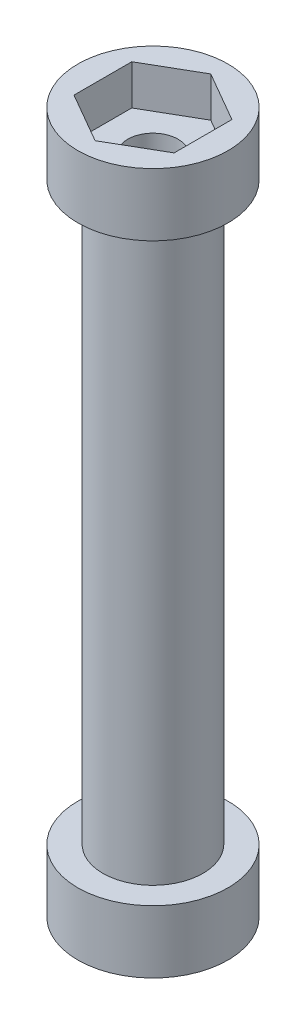
ISO-10303-21;
HEADER;
FILE_DESCRIPTION(('STEP AP214'),'2;1');
FILE_NAME('part.step','',(''),(''),'','','');
FILE_SCHEMA(('AUTOMOTIVE_DESIGN { 1 0 10303 214 1 1 1 1 }'));
ENDSEC;
DATA;
#1=APPLICATION_CONTEXT('core data for automotive mechanical design processes');
#2=APPLICATION_PROTOCOL_DEFINITION('international standard','automotive_design',2000,#1);
#3=PRODUCT_CONTEXT('',#1,'mechanical');
#4=PRODUCT('Part','Part','',(#3));
#5=PRODUCT_RELATED_PRODUCT_CATEGORY('part','',(#4));
#6=PRODUCT_DEFINITION_FORMATION('','',#4);
#7=PRODUCT_DEFINITION_CONTEXT('part definition',#1,'design');
#8=PRODUCT_DEFINITION('design','',#6,#7);
#9=PRODUCT_DEFINITION_SHAPE('','',#8);
#10=(LENGTH_UNIT() NAMED_UNIT(*) SI_UNIT(.MILLI.,.METRE.));
#11=(NAMED_UNIT(*) PLANE_ANGLE_UNIT() SI_UNIT($,.RADIAN.));
#12=(NAMED_UNIT(*) SI_UNIT($,.STERADIAN.) SOLID_ANGLE_UNIT());
#13=UNCERTAINTY_MEASURE_WITH_UNIT(LENGTH_MEASURE(1.E-05),#10,'distance_accuracy_value','');
#14=(GEOMETRIC_REPRESENTATION_CONTEXT(3) GLOBAL_UNCERTAINTY_ASSIGNED_CONTEXT((#13)) GLOBAL_UNIT_ASSIGNED_CONTEXT((#10,
#11,#12)) REPRESENTATION_CONTEXT('',''));
#15=CARTESIAN_POINT('',(0.,0.,0.));
#16=DIRECTION('',(0.,0.,1.));
#17=DIRECTION('',(1.,0.,0.));
#18=AXIS2_PLACEMENT_3D('',#15,#16,#17);
#19=CARTESIAN_POINT('',(0.,28.,0.));
#20=DIRECTION('',(0.,1.,0.));
#21=DIRECTION('',(0.,0.,1.));
#22=AXIS2_PLACEMENT_3D('',#19,#20,#21);
#23=PLANE('',#22);
#24=CARTESIAN_POINT('',(0.,28.,0.));
#25=DIRECTION('',(0.,1.,0.));
#26=DIRECTION('',(0.,0.,1.));
#27=AXIS2_PLACEMENT_3D('',#24,#25,#26);
#28=CIRCLE('',#27,3.);
#29=CARTESIAN_POINT('',(0.,28.,3.));
#30=VERTEX_POINT('',#29);
#31=EDGE_CURVE('E183',#30,#30,#28,.T.);
#32=ORIENTED_EDGE('',*,*,#31,.T.);
#33=EDGE_LOOP('',(#32));
#34=FACE_BOUND('',#33,.T.);
#35=DIRECTION('',(0.,0.,-1.));
#36=VECTOR('',#35,1.);
#37=CARTESIAN_POINT('',(-2.,28.,0.));
#38=LINE('',#37,#36);
#39=CARTESIAN_POINT('',(-2.,28.,1.15470053837925));
#40=VERTEX_POINT('',#39);
#41=CARTESIAN_POINT('',(-2.,28.,-1.15470053837925));
#42=VERTEX_POINT('',#41);
#43=EDGE_CURVE('E152',#40,#42,#38,.T.);
#44=ORIENTED_EDGE('',*,*,#43,.T.);
#45=DIRECTION('',(0.866025403784439,0.,-0.5));
#46=VECTOR('',#45,1.);
#47=CARTESIAN_POINT('',(-1.,28.,-1.73205080756888));
#48=LINE('',#47,#46);
#49=CARTESIAN_POINT('',(0.,28.,-2.3094010767585));
#50=VERTEX_POINT('',#49);
#51=EDGE_CURVE('E63',#42,#50,#48,.T.);
#52=ORIENTED_EDGE('',*,*,#51,.T.);
#53=DIRECTION('',(0.866025403784439,0.,0.5));
#54=VECTOR('',#53,1.);
#55=CARTESIAN_POINT('',(1.,28.,-1.73205080756888));
#56=LINE('',#55,#54);
#57=CARTESIAN_POINT('',(2.,28.,-1.15470053837925));
#58=VERTEX_POINT('',#57);
#59=EDGE_CURVE('E139',#50,#58,#56,.T.);
#60=ORIENTED_EDGE('',*,*,#59,.T.);
#61=DIRECTION('',(0.,0.,1.));
#62=VECTOR('',#61,1.);
#63=CARTESIAN_POINT('',(2.,28.,0.));
#64=LINE('',#63,#62);
#65=CARTESIAN_POINT('',(2.,28.,1.15470053837925));
#66=VERTEX_POINT('',#65);
#67=EDGE_CURVE('E143',#58,#66,#64,.T.);
#68=ORIENTED_EDGE('',*,*,#67,.T.);
#69=DIRECTION('',(-0.866025403784439,0.,0.5));
#70=VECTOR('',#69,1.);
#71=CARTESIAN_POINT('',(1.,28.,1.73205080756888));
#72=LINE('',#71,#70);
#73=CARTESIAN_POINT('',(0.,28.,2.3094010767585));
#74=VERTEX_POINT('',#73);
#75=EDGE_CURVE('E147',#66,#74,#72,.T.);
#76=ORIENTED_EDGE('',*,*,#75,.T.);
#77=DIRECTION('',(-0.866025403784439,0.,-0.5));
#78=VECTOR('',#77,1.);
#79=CARTESIAN_POINT('',(-1.,28.,1.73205080756888));
#80=LINE('',#79,#78);
#81=EDGE_CURVE('E125',#74,#40,#80,.T.);
#82=ORIENTED_EDGE('',*,*,#81,.T.);
#83=EDGE_LOOP('',(#44,#52,#60,#68,#76,#82));
#84=FACE_BOUND('',#83,.T.);
#85=ADVANCED_FACE('F45',(#34,#84),#23,.T.);
#86=CARTESIAN_POINT('',(0.,28.,0.));
#87=DIRECTION('',(0.,-1.,0.));
#88=DIRECTION('',(0.,0.,-1.));
#89=AXIS2_PLACEMENT_3D('',#86,#87,#88);
#90=CYLINDRICAL_SURFACE('',#89,2.);
#91=CARTESIAN_POINT('',(0.,2.5,0.));
#92=DIRECTION('',(0.,1.,0.));
#93=DIRECTION('',(0.,0.,1.));
#94=AXIS2_PLACEMENT_3D('',#91,#92,#93);
#95=CIRCLE('',#94,2.);
#96=CARTESIAN_POINT('',(0.,2.5,2.));
#97=VERTEX_POINT('',#96);
#98=EDGE_CURVE('E182',#97,#97,#95,.T.);
#99=ORIENTED_EDGE('',*,*,#98,.T.);
#100=EDGE_LOOP('',(#99));
#101=FACE_BOUND('',#100,.T.);
#102=CARTESIAN_POINT('',(0.,25.5,0.));
#103=DIRECTION('',(0.,1.,0.));
#104=DIRECTION('',(0.,0.,1.));
#105=AXIS2_PLACEMENT_3D('',#102,#103,#104);
#106=CIRCLE('',#105,2.);
#107=CARTESIAN_POINT('',(0.,25.5,2.));
#108=VERTEX_POINT('',#107);
#109=EDGE_CURVE('E11',#108,#108,#106,.T.);
#110=ORIENTED_EDGE('',*,*,#109,.F.);
#111=EDGE_LOOP('',(#110));
#112=FACE_BOUND('',#111,.T.);
#113=ADVANCED_FACE('F47',(#101,#112),#90,.T.);
#114=CARTESIAN_POINT('',(0.,0.,0.));
#115=DIRECTION('',(0.,1.,0.));
#116=DIRECTION('',(0.,0.,1.));
#117=AXIS2_PLACEMENT_3D('',#114,#115,#116);
#118=PLANE('',#117);
#119=CARTESIAN_POINT('',(0.,0.,0.));
#120=DIRECTION('',(0.,1.,0.));
#121=DIRECTION('',(0.,0.,1.));
#122=AXIS2_PLACEMENT_3D('',#119,#120,#121);
#123=CIRCLE('',#122,1.6);
#124=CARTESIAN_POINT('',(0.,0.,1.6));
#125=VERTEX_POINT('',#124);
#126=EDGE_CURVE('E174',#125,#125,#123,.T.);
#127=ORIENTED_EDGE('',*,*,#126,.T.);
#128=EDGE_LOOP('',(#127));
#129=FACE_BOUND('',#128,.T.);
#130=CARTESIAN_POINT('',(0.,0.,0.));
#131=DIRECTION('',(0.,1.,0.));
#132=DIRECTION('',(0.,0.,1.));
#133=AXIS2_PLACEMENT_3D('',#130,#131,#132);
#134=CIRCLE('',#133,3.);
#135=CARTESIAN_POINT('',(0.,0.,3.));
#136=VERTEX_POINT('',#135);
#137=EDGE_CURVE('E190',#136,#136,#134,.T.);
#138=ORIENTED_EDGE('',*,*,#137,.F.);
#139=EDGE_LOOP('',(#138));
#140=FACE_BOUND('',#139,.T.);
#141=ADVANCED_FACE('F206',(#129,#140),#118,.F.);
#142=CARTESIAN_POINT('',(0.,28.,0.));
#143=DIRECTION('',(0.,-1.,0.));
#144=DIRECTION('',(0.,0.,-1.));
#145=AXIS2_PLACEMENT_3D('',#142,#143,#144);
#146=CYLINDRICAL_SURFACE('',#145,1.);
#147=CARTESIAN_POINT('',(0.,26.4,0.));
#148=DIRECTION('',(0.,-1.,0.));
#149=DIRECTION('',(0.,0.,-1.));
#150=AXIS2_PLACEMENT_3D('',#147,#148,#149);
#151=CIRCLE('',#150,1.);
#152=CARTESIAN_POINT('',(0.,26.4,-1.));
#153=VERTEX_POINT('',#152);
#154=EDGE_CURVE('E49',#153,#153,#151,.T.);
#155=ORIENTED_EDGE('',*,*,#154,.F.);
#156=EDGE_LOOP('',(#155));
#157=FACE_BOUND('',#156,.T.);
#158=CARTESIAN_POINT('',(0.,1.5,0.));
#159=DIRECTION('',(0.,1.,0.));
#160=DIRECTION('',(0.,0.,1.));
#161=AXIS2_PLACEMENT_3D('',#158,#159,#160);
#162=CIRCLE('',#161,1.);
#163=CARTESIAN_POINT('',(0.,1.5,1.));
#164=VERTEX_POINT('',#163);
#165=EDGE_CURVE('E173',#164,#164,#162,.T.);
#166=ORIENTED_EDGE('',*,*,#165,.F.);
#167=EDGE_LOOP('',(#166));
#168=FACE_BOUND('',#167,.T.);
#169=ADVANCED_FACE('F203',(#157,#168),#146,.F.);
#170=CARTESIAN_POINT('',(0.,2.5,0.));
#171=DIRECTION('',(0.,1.,0.));
#172=DIRECTION('',(0.,0.,1.));
#173=AXIS2_PLACEMENT_3D('',#170,#171,#172);
#174=PLANE('',#173);
#175=CARTESIAN_POINT('',(0.,2.5,0.));
#176=DIRECTION('',(0.,1.,0.));
#177=DIRECTION('',(0.,0.,1.));
#178=AXIS2_PLACEMENT_3D('',#175,#176,#177);
#179=CIRCLE('',#178,3.);
#180=CARTESIAN_POINT('',(0.,2.5,3.));
#181=VERTEX_POINT('',#180);
#182=EDGE_CURVE('E55',#181,#181,#179,.T.);
#183=ORIENTED_EDGE('',*,*,#182,.T.);
#184=EDGE_LOOP('',(#183));
#185=FACE_BOUND('',#184,.T.);
#186=ORIENTED_EDGE('',*,*,#98,.F.);
#187=EDGE_LOOP('',(#186));
#188=FACE_BOUND('',#187,.T.);
#189=ADVANCED_FACE('F205',(#185,#188),#174,.T.);
#190=CARTESIAN_POINT('',(0.,2.5,0.));
#191=DIRECTION('',(0.,-1.,0.));
#192=DIRECTION('',(0.,0.,-1.));
#193=AXIS2_PLACEMENT_3D('',#190,#191,#192);
#194=CYLINDRICAL_SURFACE('',#193,3.);
#195=ORIENTED_EDGE('',*,*,#182,.F.);
#196=EDGE_LOOP('',(#195));
#197=FACE_BOUND('',#196,.T.);
#198=ORIENTED_EDGE('',*,*,#137,.T.);
#199=EDGE_LOOP('',(#198));
#200=FACE_BOUND('',#199,.T.);
#201=ADVANCED_FACE('F213',(#197,#200),#194,.T.);
#202=CARTESIAN_POINT('',(0.,25.5,0.));
#203=DIRECTION('',(0.,1.,0.));
#204=DIRECTION('',(0.,0.,1.));
#205=AXIS2_PLACEMENT_3D('',#202,#203,#204);
#206=CYLINDRICAL_SURFACE('',#205,3.);
#207=CARTESIAN_POINT('',(0.,25.5,0.));
#208=DIRECTION('',(0.,1.,0.));
#209=DIRECTION('',(0.,0.,1.));
#210=AXIS2_PLACEMENT_3D('',#207,#208,#209);
#211=CIRCLE('',#210,3.);
#212=CARTESIAN_POINT('',(0.,25.5,3.));
#213=VERTEX_POINT('',#212);
#214=EDGE_CURVE('E178',#213,#213,#211,.T.);
#215=ORIENTED_EDGE('',*,*,#214,.T.);
#216=EDGE_LOOP('',(#215));
#217=FACE_BOUND('',#216,.T.);
#218=ORIENTED_EDGE('',*,*,#31,.F.);
#219=EDGE_LOOP('',(#218));
#220=FACE_BOUND('',#219,.T.);
#221=ADVANCED_FACE('F261',(#217,#220),#206,.T.);
#222=CARTESIAN_POINT('',(0.,25.5,0.));
#223=DIRECTION('',(0.,1.,0.));
#224=DIRECTION('',(0.,0.,1.));
#225=AXIS2_PLACEMENT_3D('',#222,#223,#224);
#226=PLANE('',#225);
#227=ORIENTED_EDGE('',*,*,#109,.T.);
#228=EDGE_LOOP('',(#227));
#229=FACE_BOUND('',#228,.T.);
#230=ORIENTED_EDGE('',*,*,#214,.F.);
#231=EDGE_LOOP('',(#230));
#232=FACE_BOUND('',#231,.T.);
#233=ADVANCED_FACE('F257',(#229,#232),#226,.F.);
#234=CARTESIAN_POINT('',(0.,1.5,0.));
#235=DIRECTION('',(0.,-1.,0.));
#236=DIRECTION('',(0.,0.,-1.));
#237=AXIS2_PLACEMENT_3D('',#234,#235,#236);
#238=CYLINDRICAL_SURFACE('',#237,1.6);
#239=CARTESIAN_POINT('',(0.,1.5,0.));
#240=DIRECTION('',(0.,1.,0.));
#241=DIRECTION('',(0.,0.,1.));
#242=AXIS2_PLACEMENT_3D('',#239,#240,#241);
#243=CIRCLE('',#242,1.6);
#244=CARTESIAN_POINT('',(0.,1.5,1.6));
#245=VERTEX_POINT('',#244);
#246=EDGE_CURVE('E169',#245,#245,#243,.T.);
#247=ORIENTED_EDGE('',*,*,#246,.T.);
#248=EDGE_LOOP('',(#247));
#249=FACE_BOUND('',#248,.T.);
#250=ORIENTED_EDGE('',*,*,#126,.F.);
#251=EDGE_LOOP('',(#250));
#252=FACE_BOUND('',#251,.T.);
#253=ADVANCED_FACE('F254',(#249,#252),#238,.F.);
#254=CARTESIAN_POINT('',(0.,1.5,0.));
#255=DIRECTION('',(0.,1.,0.));
#256=DIRECTION('',(0.,0.,1.));
#257=AXIS2_PLACEMENT_3D('',#254,#255,#256);
#258=PLANE('',#257);
#259=ORIENTED_EDGE('',*,*,#165,.T.);
#260=EDGE_LOOP('',(#259));
#261=FACE_BOUND('',#260,.T.);
#262=ORIENTED_EDGE('',*,*,#246,.F.);
#263=EDGE_LOOP('',(#262));
#264=FACE_BOUND('',#263,.T.);
#265=ADVANCED_FACE('F200',(#261,#264),#258,.F.);
#266=CARTESIAN_POINT('',(-1.,26.4,-1.73205080756888));
#267=DIRECTION('',(0.5,0.,0.866025403784439));
#268=DIRECTION('',(0.866025403784439,0.,-0.5));
#269=AXIS2_PLACEMENT_3D('',#266,#267,#268);
#270=PLANE('',#269);
#271=ORIENTED_EDGE('',*,*,#51,.F.);
#272=DIRECTION('',(0.,1.,0.));
#273=VECTOR('',#272,1.);
#274=CARTESIAN_POINT('',(-2.,26.4,-1.15470053837925));
#275=LINE('',#274,#273);
#276=CARTESIAN_POINT('',(-2.,26.4,-1.15470053837925));
#277=VERTEX_POINT('',#276);
#278=EDGE_CURVE('E133',#277,#42,#275,.T.);
#279=ORIENTED_EDGE('',*,*,#278,.F.);
#280=DIRECTION('',(0.866025403784439,0.,-0.5));
#281=VECTOR('',#280,1.);
#282=CARTESIAN_POINT('',(-1.,26.4,-1.73205080756888));
#283=LINE('',#282,#281);
#284=CARTESIAN_POINT('',(0.,26.4,-2.3094010767585));
#285=VERTEX_POINT('',#284);
#286=EDGE_CURVE('E156',#277,#285,#283,.T.);
#287=ORIENTED_EDGE('',*,*,#286,.T.);
#288=DIRECTION('',(0.,1.,0.));
#289=VECTOR('',#288,1.);
#290=CARTESIAN_POINT('',(0.,26.4,-2.3094010767585));
#291=LINE('',#290,#289);
#292=EDGE_CURVE('E166',#285,#50,#291,.T.);
#293=ORIENTED_EDGE('',*,*,#292,.T.);
#294=EDGE_LOOP('',(#271,#279,#287,#293));
#295=FACE_BOUND('',#294,.T.);
#296=ADVANCED_FACE('F229',(#295),#270,.T.);
#297=CARTESIAN_POINT('',(1.,26.4,-1.73205080756888));
#298=DIRECTION('',(-0.5,0.,0.866025403784439));
#299=DIRECTION('',(0.866025403784439,0.,0.5));
#300=AXIS2_PLACEMENT_3D('',#297,#298,#299);
#301=PLANE('',#300);
#302=ORIENTED_EDGE('',*,*,#59,.F.);
#303=ORIENTED_EDGE('',*,*,#292,.F.);
#304=DIRECTION('',(0.866025403784439,0.,0.5));
#305=VECTOR('',#304,1.);
#306=CARTESIAN_POINT('',(1.,26.4,-1.73205080756888));
#307=LINE('',#306,#305);
#308=CARTESIAN_POINT('',(2.,26.4,-1.15470053837925));
#309=VERTEX_POINT('',#308);
#310=EDGE_CURVE('E102',#285,#309,#307,.T.);
#311=ORIENTED_EDGE('',*,*,#310,.T.);
#312=DIRECTION('',(0.,1.,0.));
#313=VECTOR('',#312,1.);
#314=CARTESIAN_POINT('',(2.,26.4,-1.15470053837925));
#315=LINE('',#314,#313);
#316=EDGE_CURVE('E163',#309,#58,#315,.T.);
#317=ORIENTED_EDGE('',*,*,#316,.T.);
#318=EDGE_LOOP('',(#302,#303,#311,#317));
#319=FACE_BOUND('',#318,.T.);
#320=ADVANCED_FACE('F241',(#319),#301,.T.);
#321=CARTESIAN_POINT('',(2.,26.4,0.));
#322=DIRECTION('',(-1.,0.,0.));
#323=DIRECTION('',(0.,0.,1.));
#324=AXIS2_PLACEMENT_3D('',#321,#322,#323);
#325=PLANE('',#324);
#326=ORIENTED_EDGE('',*,*,#67,.F.);
#327=ORIENTED_EDGE('',*,*,#316,.F.);
#328=DIRECTION('',(0.,0.,1.));
#329=VECTOR('',#328,1.);
#330=CARTESIAN_POINT('',(2.,26.4,0.));
#331=LINE('',#330,#329);
#332=CARTESIAN_POINT('',(2.,26.4,1.15470053837925));
#333=VERTEX_POINT('',#332);
#334=EDGE_CURVE('E121',#309,#333,#331,.T.);
#335=ORIENTED_EDGE('',*,*,#334,.T.);
#336=DIRECTION('',(0.,1.,0.));
#337=VECTOR('',#336,1.);
#338=CARTESIAN_POINT('',(2.,26.4,1.15470053837925));
#339=LINE('',#338,#337);
#340=EDGE_CURVE('E117',#333,#66,#339,.T.);
#341=ORIENTED_EDGE('',*,*,#340,.T.);
#342=EDGE_LOOP('',(#326,#327,#335,#341));
#343=FACE_BOUND('',#342,.T.);
#344=ADVANCED_FACE('F239',(#343),#325,.T.);
#345=CARTESIAN_POINT('',(1.,26.4,1.73205080756888));
#346=DIRECTION('',(-0.5,0.,-0.866025403784439));
#347=DIRECTION('',(-0.866025403784439,0.,0.5));
#348=AXIS2_PLACEMENT_3D('',#345,#346,#347);
#349=PLANE('',#348);
#350=ORIENTED_EDGE('',*,*,#75,.F.);
#351=ORIENTED_EDGE('',*,*,#340,.F.);
#352=DIRECTION('',(-0.866025403784439,0.,0.5));
#353=VECTOR('',#352,1.);
#354=CARTESIAN_POINT('',(1.,26.4,1.73205080756888));
#355=LINE('',#354,#353);
#356=CARTESIAN_POINT('',(0.,26.4,2.3094010767585));
#357=VERTEX_POINT('',#356);
#358=EDGE_CURVE('E112',#333,#357,#355,.T.);
#359=ORIENTED_EDGE('',*,*,#358,.T.);
#360=DIRECTION('',(0.,1.,0.));
#361=VECTOR('',#360,1.);
#362=CARTESIAN_POINT('',(0.,26.4,2.3094010767585));
#363=LINE('',#362,#361);
#364=EDGE_CURVE('E116',#357,#74,#363,.T.);
#365=ORIENTED_EDGE('',*,*,#364,.T.);
#366=EDGE_LOOP('',(#350,#351,#359,#365));
#367=FACE_BOUND('',#366,.T.);
#368=ADVANCED_FACE('F115',(#367),#349,.T.);
#369=CARTESIAN_POINT('',(-1.,26.4,1.73205080756888));
#370=DIRECTION('',(0.5,0.,-0.866025403784439));
#371=DIRECTION('',(-0.866025403784439,0.,-0.5));
#372=AXIS2_PLACEMENT_3D('',#369,#370,#371);
#373=PLANE('',#372);
#374=ORIENTED_EDGE('',*,*,#81,.F.);
#375=ORIENTED_EDGE('',*,*,#364,.F.);
#376=DIRECTION('',(-0.866025403784439,0.,-0.5));
#377=VECTOR('',#376,1.);
#378=CARTESIAN_POINT('',(-1.,26.4,1.73205080756888));
#379=LINE('',#378,#377);
#380=CARTESIAN_POINT('',(-2.,26.4,1.15470053837925));
#381=VERTEX_POINT('',#380);
#382=EDGE_CURVE('E120',#357,#381,#379,.T.);
#383=ORIENTED_EDGE('',*,*,#382,.T.);
#384=DIRECTION('',(0.,1.,0.));
#385=VECTOR('',#384,1.);
#386=CARTESIAN_POINT('',(-2.,26.4,1.15470053837925));
#387=LINE('',#386,#385);
#388=EDGE_CURVE('E93',#381,#40,#387,.T.);
#389=ORIENTED_EDGE('',*,*,#388,.T.);
#390=EDGE_LOOP('',(#374,#375,#383,#389));
#391=FACE_BOUND('',#390,.T.);
#392=ADVANCED_FACE('F123',(#391),#373,.T.);
#393=CARTESIAN_POINT('',(-2.,26.4,0.));
#394=DIRECTION('',(1.,0.,0.));
#395=DIRECTION('',(0.,0.,-1.));
#396=AXIS2_PLACEMENT_3D('',#393,#394,#395);
#397=PLANE('',#396);
#398=ORIENTED_EDGE('',*,*,#43,.F.);
#399=ORIENTED_EDGE('',*,*,#388,.F.);
#400=DIRECTION('',(0.,0.,-1.));
#401=VECTOR('',#400,1.);
#402=CARTESIAN_POINT('',(-2.,26.4,0.));
#403=LINE('',#402,#401);
#404=EDGE_CURVE('E71',#381,#277,#403,.T.);
#405=ORIENTED_EDGE('',*,*,#404,.T.);
#406=ORIENTED_EDGE('',*,*,#278,.T.);
#407=EDGE_LOOP('',(#398,#399,#405,#406));
#408=FACE_BOUND('',#407,.T.);
#409=ADVANCED_FACE('F228',(#408),#397,.T.);
#410=CARTESIAN_POINT('',(0.,26.4,0.));
#411=DIRECTION('',(0.,-1.,0.));
#412=DIRECTION('',(0.,0.,-1.));
#413=AXIS2_PLACEMENT_3D('',#410,#411,#412);
#414=PLANE('',#413);
#415=ORIENTED_EDGE('',*,*,#154,.T.);
#416=EDGE_LOOP('',(#415));
#417=FACE_BOUND('',#416,.T.);
#418=ORIENTED_EDGE('',*,*,#286,.F.);
#419=ORIENTED_EDGE('',*,*,#404,.F.);
#420=ORIENTED_EDGE('',*,*,#382,.F.);
#421=ORIENTED_EDGE('',*,*,#358,.F.);
#422=ORIENTED_EDGE('',*,*,#334,.F.);
#423=ORIENTED_EDGE('',*,*,#310,.F.);
#424=EDGE_LOOP('',(#418,#419,#420,#421,#422,#423));
#425=FACE_BOUND('',#424,.T.);
#426=ADVANCED_FACE('F129',(#417,#425),#414,.F.);
#427=CLOSED_SHELL('',(#85,#113,#141,#169,#189,#201,#221,#233,#253,#265,#296,#320,#344,#368,#392,
#409,#426));
#428=MANIFOLD_SOLID_BREP('B2',#427);
#429=ADVANCED_BREP_SHAPE_REPRESENTATION('',(#18,#428),#14);
#430=SHAPE_DEFINITION_REPRESENTATION(#9,#429);
ENDSEC;
END-ISO-10303-21;
